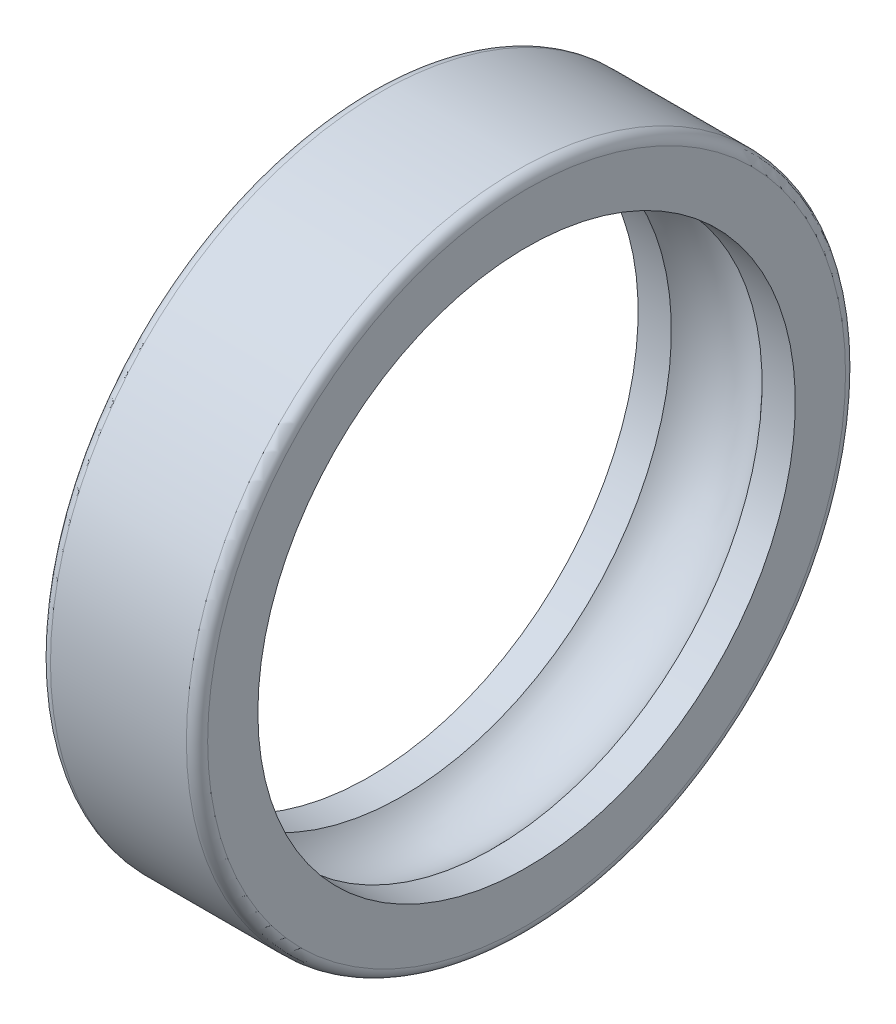
ISO-10303-21;
HEADER;
FILE_DESCRIPTION(('STEP AP214'),'2;1');
FILE_NAME('part.step','',(''),(''),'','','');
FILE_SCHEMA(('AUTOMOTIVE_DESIGN { 1 0 10303 214 1 1 1 1 }'));
ENDSEC;
DATA;
#1=APPLICATION_CONTEXT('core data for automotive mechanical design processes');
#2=APPLICATION_PROTOCOL_DEFINITION('international standard','automotive_design',2000,#1);
#3=PRODUCT_CONTEXT('',#1,'mechanical');
#4=PRODUCT('Part','Part','',(#3));
#5=PRODUCT_RELATED_PRODUCT_CATEGORY('part','',(#4));
#6=PRODUCT_DEFINITION_FORMATION('','',#4);
#7=PRODUCT_DEFINITION_CONTEXT('part definition',#1,'design');
#8=PRODUCT_DEFINITION('design','',#6,#7);
#9=PRODUCT_DEFINITION_SHAPE('','',#8);
#10=(LENGTH_UNIT() NAMED_UNIT(*) SI_UNIT(.MILLI.,.METRE.));
#11=(NAMED_UNIT(*) PLANE_ANGLE_UNIT() SI_UNIT($,.RADIAN.));
#12=(NAMED_UNIT(*) SI_UNIT($,.STERADIAN.) SOLID_ANGLE_UNIT());
#13=UNCERTAINTY_MEASURE_WITH_UNIT(LENGTH_MEASURE(1.E-05),#10,'distance_accuracy_value','');
#14=(GEOMETRIC_REPRESENTATION_CONTEXT(3) GLOBAL_UNCERTAINTY_ASSIGNED_CONTEXT((#13)) GLOBAL_UNIT_ASSIGNED_CONTEXT((#10,
#11,#12)) REPRESENTATION_CONTEXT('',''));
#15=CARTESIAN_POINT('',(0.,0.,0.));
#16=DIRECTION('',(0.,0.,1.));
#17=DIRECTION('',(1.,0.,0.));
#18=AXIS2_PLACEMENT_3D('',#15,#16,#17);
#19=CARTESIAN_POINT('',(-8.0635838150289,0.,0.));
#20=DIRECTION('',(-1.,0.,0.));
#21=DIRECTION('',(0.,0.,1.));
#22=AXIS2_PLACEMENT_3D('',#19,#20,#21);
#23=CYLINDRICAL_SURFACE('',#22,65.);
#24=CARTESIAN_POINT('',(13.4,0.,0.));
#25=DIRECTION('',(1.,0.,0.));
#26=DIRECTION('',(0.,0.,-1.));
#27=AXIS2_PLACEMENT_3D('',#24,#25,#26);
#28=CIRCLE('',#27,65.);
#29=CARTESIAN_POINT('',(13.4,0.,-65.));
#30=VERTEX_POINT('',#29);
#31=EDGE_CURVE('E54',#30,#30,#28,.F.);
#32=ORIENTED_EDGE('',*,*,#31,.T.);
#33=EDGE_LOOP('',(#32));
#34=FACE_BOUND('',#33,.T.);
#35=CARTESIAN_POINT('',(-13.4,0.,0.));
#36=DIRECTION('',(1.,0.,0.));
#37=DIRECTION('',(0.,0.,-1.));
#38=AXIS2_PLACEMENT_3D('',#35,#36,#37);
#39=CIRCLE('',#38,65.);
#40=CARTESIAN_POINT('',(-13.4,0.,-65.));
#41=VERTEX_POINT('',#40);
#42=EDGE_CURVE('E59',#41,#41,#39,.T.);
#43=ORIENTED_EDGE('',*,*,#42,.T.);
#44=EDGE_LOOP('',(#43));
#45=FACE_BOUND('',#44,.T.);
#46=ADVANCED_FACE('F41',(#34,#45),#23,.T.);
#47=CARTESIAN_POINT('',(15.5,65.,0.));
#48=DIRECTION('',(1.,0.,0.));
#49=DIRECTION('',(0.,0.,-1.));
#50=AXIS2_PLACEMENT_3D('',#47,#48,#49);
#51=PLANE('',#50);
#52=CARTESIAN_POINT('',(15.5,0.,0.));
#53=DIRECTION('',(1.,0.,0.));
#54=DIRECTION('',(0.,0.,-1.));
#55=AXIS2_PLACEMENT_3D('',#52,#53,#54);
#56=CIRCLE('',#55,62.9);
#57=CARTESIAN_POINT('',(15.5,0.,-62.9));
#58=VERTEX_POINT('',#57);
#59=EDGE_CURVE('E49',#58,#58,#56,.T.);
#60=ORIENTED_EDGE('',*,*,#59,.T.);
#61=EDGE_LOOP('',(#60));
#62=FACE_BOUND('',#61,.T.);
#63=CARTESIAN_POINT('',(15.5,0.,0.));
#64=DIRECTION('',(-1.,0.,0.));
#65=DIRECTION('',(0.,0.,1.));
#66=AXIS2_PLACEMENT_3D('',#63,#64,#65);
#67=CIRCLE('',#66,53.);
#68=CARTESIAN_POINT('',(15.5,0.,53.));
#69=VERTEX_POINT('',#68);
#70=EDGE_CURVE('E65',#69,#69,#67,.T.);
#71=ORIENTED_EDGE('',*,*,#70,.T.);
#72=EDGE_LOOP('',(#71));
#73=FACE_BOUND('',#72,.T.);
#74=ADVANCED_FACE('F97',(#62,#73),#51,.T.);
#75=CARTESIAN_POINT('',(-8.0635838150289,0.,0.));
#76=DIRECTION('',(-1.,0.,0.));
#77=DIRECTION('',(0.,0.,1.));
#78=AXIS2_PLACEMENT_3D('',#75,#76,#77);
#79=CYLINDRICAL_SURFACE('',#78,53.);
#80=CARTESIAN_POINT('',(8.94427190999916,0.,0.));
#81=DIRECTION('',(-1.,0.,0.));
#82=DIRECTION('',(0.,0.,1.));
#83=AXIS2_PLACEMENT_3D('',#80,#81,#82);
#84=CIRCLE('',#83,53.);
#85=CARTESIAN_POINT('',(8.94427190999916,0.,53.));
#86=VERTEX_POINT('',#85);
#87=EDGE_CURVE('E69',#86,#86,#84,.T.);
#88=ORIENTED_EDGE('',*,*,#87,.T.);
#89=EDGE_LOOP('',(#88));
#90=FACE_BOUND('',#89,.T.);
#91=ORIENTED_EDGE('',*,*,#70,.F.);
#92=EDGE_LOOP('',(#91));
#93=FACE_BOUND('',#92,.T.);
#94=ADVANCED_FACE('F103',(#90,#93),#79,.F.);
#95=CARTESIAN_POINT('',(0.,0.,0.));
#96=DIRECTION('',(-1.,0.,0.));
#97=DIRECTION('',(0.,0.,1.));
#98=AXIS2_PLACEMENT_3D('',#95,#96,#97);
#99=TOROIDAL_SURFACE('',#98,45.,12.);
#100=ORIENTED_EDGE('',*,*,#87,.F.);
#101=EDGE_LOOP('',(#100));
#102=FACE_BOUND('',#101,.T.);
#103=CARTESIAN_POINT('',(-8.94427190999916,0.,0.));
#104=DIRECTION('',(-1.,0.,0.));
#105=DIRECTION('',(0.,0.,1.));
#106=AXIS2_PLACEMENT_3D('',#103,#104,#105);
#107=CIRCLE('',#106,53.);
#108=CARTESIAN_POINT('',(-8.94427190999916,0.,53.));
#109=VERTEX_POINT('',#108);
#110=EDGE_CURVE('E73',#109,#109,#107,.T.);
#111=ORIENTED_EDGE('',*,*,#110,.T.);
#112=EDGE_LOOP('',(#111));
#113=FACE_BOUND('',#112,.T.);
#114=ADVANCED_FACE('F94',(#102,#113),#99,.F.);
#115=CARTESIAN_POINT('',(-8.0635838150289,0.,0.));
#116=DIRECTION('',(-1.,0.,0.));
#117=DIRECTION('',(0.,0.,1.));
#118=AXIS2_PLACEMENT_3D('',#115,#116,#117);
#119=CYLINDRICAL_SURFACE('',#118,53.);
#120=CARTESIAN_POINT('',(-15.5,0.,0.));
#121=DIRECTION('',(-1.,0.,0.));
#122=DIRECTION('',(0.,0.,1.));
#123=AXIS2_PLACEMENT_3D('',#120,#121,#122);
#124=CIRCLE('',#123,53.);
#125=CARTESIAN_POINT('',(-15.5,0.,53.));
#126=VERTEX_POINT('',#125);
#127=EDGE_CURVE('E77',#126,#126,#124,.T.);
#128=ORIENTED_EDGE('',*,*,#127,.T.);
#129=EDGE_LOOP('',(#128));
#130=FACE_BOUND('',#129,.T.);
#131=ORIENTED_EDGE('',*,*,#110,.F.);
#132=EDGE_LOOP('',(#131));
#133=FACE_BOUND('',#132,.T.);
#134=ADVANCED_FACE('F82',(#130,#133),#119,.F.);
#135=CARTESIAN_POINT('',(-15.5,65.,0.));
#136=DIRECTION('',(1.,0.,0.));
#137=DIRECTION('',(0.,0.,-1.));
#138=AXIS2_PLACEMENT_3D('',#135,#136,#137);
#139=PLANE('',#138);
#140=CARTESIAN_POINT('',(-15.5,0.,0.));
#141=DIRECTION('',(1.,0.,0.));
#142=DIRECTION('',(0.,0.,-1.));
#143=AXIS2_PLACEMENT_3D('',#140,#141,#142);
#144=CIRCLE('',#143,62.9);
#145=CARTESIAN_POINT('',(-15.5,0.,-62.9));
#146=VERTEX_POINT('',#145);
#147=EDGE_CURVE('E10',#146,#146,#144,.F.);
#148=ORIENTED_EDGE('',*,*,#147,.T.);
#149=EDGE_LOOP('',(#148));
#150=FACE_BOUND('',#149,.T.);
#151=ORIENTED_EDGE('',*,*,#127,.F.);
#152=EDGE_LOOP('',(#151));
#153=FACE_BOUND('',#152,.T.);
#154=ADVANCED_FACE('F85',(#150,#153),#139,.F.);
#155=CARTESIAN_POINT('',(13.4,0.,0.));
#156=DIRECTION('',(1.,0.,0.));
#157=DIRECTION('',(0.,0.,-1.));
#158=AXIS2_PLACEMENT_3D('',#155,#156,#157);
#159=TOROIDAL_SURFACE('',#158,62.9,2.1);
#160=ORIENTED_EDGE('',*,*,#59,.F.);
#161=EDGE_LOOP('',(#160));
#162=FACE_BOUND('',#161,.T.);
#163=ORIENTED_EDGE('',*,*,#31,.F.);
#164=EDGE_LOOP('',(#163));
#165=FACE_BOUND('',#164,.T.);
#166=ADVANCED_FACE('F87',(#162,#165),#159,.T.);
#167=CARTESIAN_POINT('',(-13.4,0.,0.));
#168=DIRECTION('',(1.,0.,0.));
#169=DIRECTION('',(0.,0.,-1.));
#170=AXIS2_PLACEMENT_3D('',#167,#168,#169);
#171=TOROIDAL_SURFACE('',#170,62.9,2.1);
#172=ORIENTED_EDGE('',*,*,#42,.F.);
#173=EDGE_LOOP('',(#172));
#174=FACE_BOUND('',#173,.T.);
#175=ORIENTED_EDGE('',*,*,#147,.F.);
#176=EDGE_LOOP('',(#175));
#177=FACE_BOUND('',#176,.T.);
#178=ADVANCED_FACE('F43',(#174,#177),#171,.T.);
#179=CLOSED_SHELL('',(#46,#74,#94,#114,#134,#154,#166,#178));
#180=MANIFOLD_SOLID_BREP('B2',#179);
#181=ADVANCED_BREP_SHAPE_REPRESENTATION('',(#18,#180),#14);
#182=SHAPE_DEFINITION_REPRESENTATION(#9,#181);
ENDSEC;
END-ISO-10303-21;
